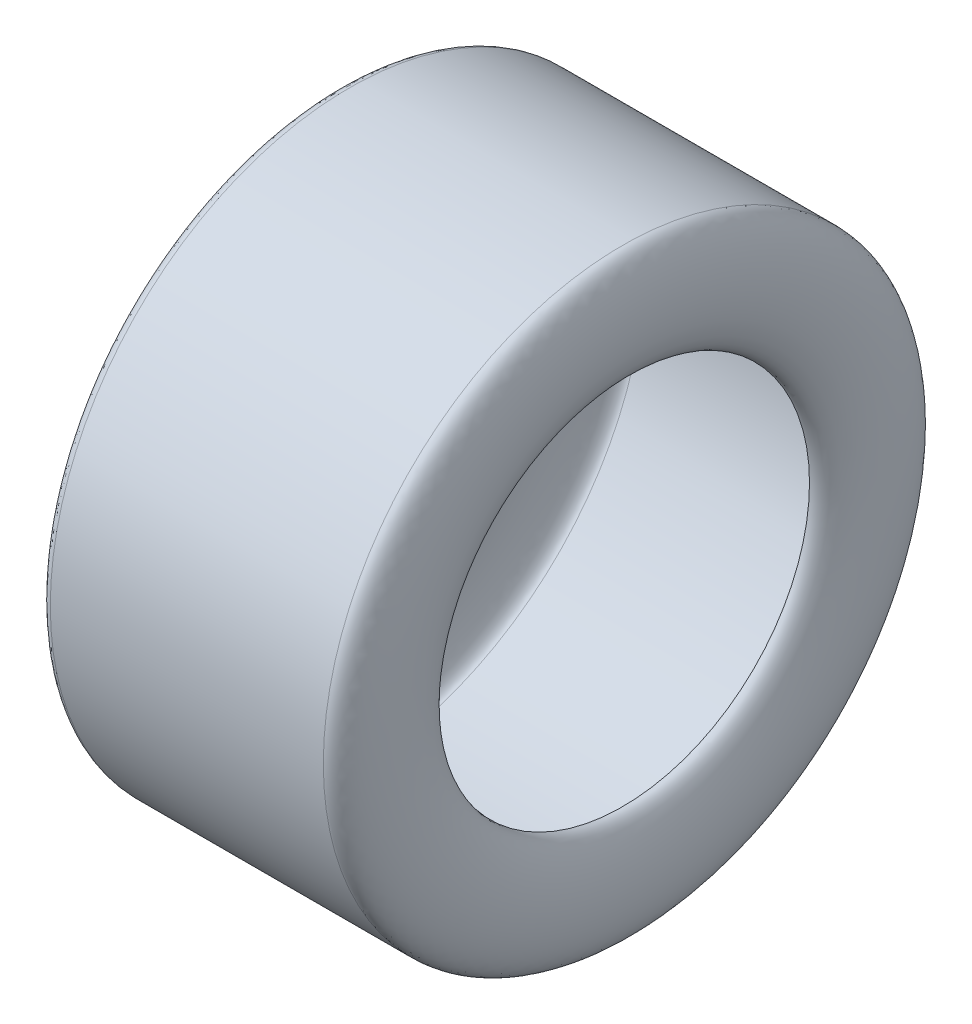
ISO-10303-21;
HEADER;
FILE_DESCRIPTION(('STEP AP214'),'2;1');
FILE_NAME('part.step','',(''),(''),'','','');
FILE_SCHEMA(('AUTOMOTIVE_DESIGN { 1 0 10303 214 1 1 1 1 }'));
ENDSEC;
DATA;
#1=APPLICATION_CONTEXT('core data for automotive mechanical design processes');
#2=APPLICATION_PROTOCOL_DEFINITION('international standard','automotive_design',2000,#1);
#3=PRODUCT_CONTEXT('',#1,'mechanical');
#4=PRODUCT('Part','Part','',(#3));
#5=PRODUCT_RELATED_PRODUCT_CATEGORY('part','',(#4));
#6=PRODUCT_DEFINITION_FORMATION('','',#4);
#7=PRODUCT_DEFINITION_CONTEXT('part definition',#1,'design');
#8=PRODUCT_DEFINITION('design','',#6,#7);
#9=PRODUCT_DEFINITION_SHAPE('','',#8);
#10=(LENGTH_UNIT() NAMED_UNIT(*) SI_UNIT(.MILLI.,.METRE.));
#11=(NAMED_UNIT(*) PLANE_ANGLE_UNIT() SI_UNIT($,.RADIAN.));
#12=(NAMED_UNIT(*) SI_UNIT($,.STERADIAN.) SOLID_ANGLE_UNIT());
#13=UNCERTAINTY_MEASURE_WITH_UNIT(LENGTH_MEASURE(1.E-05),#10,'distance_accuracy_value','');
#14=(GEOMETRIC_REPRESENTATION_CONTEXT(3) GLOBAL_UNCERTAINTY_ASSIGNED_CONTEXT((#13)) GLOBAL_UNIT_ASSIGNED_CONTEXT((#10,
#11,#12)) REPRESENTATION_CONTEXT('',''));
#15=CARTESIAN_POINT('',(0.,0.,0.));
#16=DIRECTION('',(0.,0.,1.));
#17=DIRECTION('',(1.,0.,0.));
#18=AXIS2_PLACEMENT_3D('',#15,#16,#17);
#19=CARTESIAN_POINT('',(92.71,0.,0.));
#20=DIRECTION('',(1.,0.,0.));
#21=DIRECTION('',(0.,0.,-1.));
#22=AXIS2_PLACEMENT_3D('',#19,#20,#21);
#23=PLANE('',#22);
#24=CARTESIAN_POINT('',(92.71,0.,0.));
#25=DIRECTION('',(1.,0.,0.));
#26=DIRECTION('',(0.,0.,-1.));
#27=AXIS2_PLACEMENT_3D('',#24,#25,#26);
#28=CIRCLE('',#27,127.);
#29=CARTESIAN_POINT('',(92.71,0.,-127.));
#30=VERTEX_POINT('',#29);
#31=EDGE_CURVE('E5083',#30,#30,#28,.T.);
#32=ORIENTED_EDGE('',*,*,#31,.T.);
#33=EDGE_LOOP('',(#32));
#34=FACE_BOUND('',#33,.T.);
#35=CARTESIAN_POINT('',(92.71,0.,0.));
#36=DIRECTION('',(1.,0.,0.));
#37=DIRECTION('',(0.,1.,0.));
#38=AXIS2_PLACEMENT_3D('',#35,#36,#37);
#39=CIRCLE('',#38,129.54);
#40=CARTESIAN_POINT('',(92.71,129.54,0.));
#41=VERTEX_POINT('',#40);
#42=EDGE_CURVE('E5086',#41,#41,#39,.T.);
#43=ORIENTED_EDGE('',*,*,#42,.F.);
#44=EDGE_LOOP('',(#43));
#45=FACE_BOUND('',#44,.T.);
#46=ADVANCED_FACE('F5029',(#34,#45),#23,.F.);
#47=CARTESIAN_POINT('',(-92.71,0.,0.));
#48=DIRECTION('',(1.,0.,0.));
#49=DIRECTION('',(0.,0.,-1.));
#50=AXIS2_PLACEMENT_3D('',#47,#48,#49);
#51=PLANE('',#50);
#52=CARTESIAN_POINT('',(-92.71,0.,0.));
#53=DIRECTION('',(1.,0.,0.));
#54=DIRECTION('',(0.,0.,-1.));
#55=AXIS2_PLACEMENT_3D('',#52,#53,#54);
#56=CIRCLE('',#55,127.);
#57=CARTESIAN_POINT('',(-92.71,0.,-127.));
#58=VERTEX_POINT('',#57);
#59=EDGE_CURVE('E12',#58,#58,#56,.T.);
#60=ORIENTED_EDGE('',*,*,#59,.F.);
#61=EDGE_LOOP('',(#60));
#62=FACE_BOUND('',#61,.T.);
#63=CARTESIAN_POINT('',(-92.71,0.,0.));
#64=DIRECTION('',(1.,0.,0.));
#65=DIRECTION('',(0.,1.,0.));
#66=AXIS2_PLACEMENT_3D('',#63,#64,#65);
#67=CIRCLE('',#66,129.54);
#68=CARTESIAN_POINT('',(-92.71,129.54,0.));
#69=VERTEX_POINT('',#68);
#70=EDGE_CURVE('E5091',#69,#69,#67,.T.);
#71=ORIENTED_EDGE('',*,*,#70,.T.);
#72=EDGE_LOOP('',(#71));
#73=FACE_BOUND('',#72,.T.);
#74=ADVANCED_FACE('F5031',(#62,#73),#51,.T.);
#75=CARTESIAN_POINT('',(-92.71,165.1,0.));
#76=DIRECTION('',(0.,0.,1.));
#77=DIRECTION('',(0.,1.,0.));
#78=AXIS2_PLACEMENT_3D('',#75,#76,#77);
#79=ELLIPSE('',#78,38.1,13.97);
#80=CARTESIAN_POINT('',(0.,0.,0.));
#81=DIRECTION('',(1.,0.,0.));
#82=AXIS1_PLACEMENT('',#80,#81);
#83=SURFACE_OF_REVOLUTION('',#79,#82);
#84=ORIENTED_EDGE('',*,*,#59,.T.);
#85=EDGE_LOOP('',(#84));
#86=FACE_BOUND('',#85,.T.);
#87=CARTESIAN_POINT('',(-92.71,0.,0.));
#88=DIRECTION('',(1.,0.,0.));
#89=DIRECTION('',(0.,0.,-1.));
#90=AXIS2_PLACEMENT_3D('',#87,#88,#89);
#91=CIRCLE('',#90,203.2);
#92=CARTESIAN_POINT('',(-92.71,0.,-203.2));
#93=VERTEX_POINT('',#92);
#94=EDGE_CURVE('E5037',#93,#93,#91,.T.);
#95=ORIENTED_EDGE('',*,*,#94,.F.);
#96=EDGE_LOOP('',(#95));
#97=FACE_BOUND('',#96,.T.);
#98=ADVANCED_FACE('F5068',(#86,#97),#83,.F.);
#99=CARTESIAN_POINT('',(0.,0.,0.));
#100=DIRECTION('',(1.,0.,0.));
#101=DIRECTION('',(0.,0.,-1.));
#102=AXIS2_PLACEMENT_3D('',#99,#100,#101);
#103=CYLINDRICAL_SURFACE('',#102,203.2);
#104=ORIENTED_EDGE('',*,*,#94,.T.);
#105=EDGE_LOOP('',(#104));
#106=FACE_BOUND('',#105,.T.);
#107=CARTESIAN_POINT('',(92.71,0.,0.));
#108=DIRECTION('',(1.,0.,0.));
#109=DIRECTION('',(0.,0.,-1.));
#110=AXIS2_PLACEMENT_3D('',#107,#108,#109);
#111=CIRCLE('',#110,203.2);
#112=CARTESIAN_POINT('',(92.71,0.,-203.2));
#113=VERTEX_POINT('',#112);
#114=EDGE_CURVE('E5042',#113,#113,#111,.T.);
#115=ORIENTED_EDGE('',*,*,#114,.F.);
#116=EDGE_LOOP('',(#115));
#117=FACE_BOUND('',#116,.T.);
#118=ADVANCED_FACE('F5058',(#106,#117),#103,.T.);
#119=CARTESIAN_POINT('',(92.71,165.1,0.));
#120=DIRECTION('',(0.,0.,1.));
#121=DIRECTION('',(0.,-1.,0.));
#122=AXIS2_PLACEMENT_3D('',#119,#120,#121);
#123=ELLIPSE('',#122,38.1,13.97);
#124=CARTESIAN_POINT('',(0.,0.,0.));
#125=DIRECTION('',(1.,0.,0.));
#126=AXIS1_PLACEMENT('',#124,#125);
#127=SURFACE_OF_REVOLUTION('',#123,#126);
#128=ORIENTED_EDGE('',*,*,#114,.T.);
#129=EDGE_LOOP('',(#128));
#130=FACE_BOUND('',#129,.T.);
#131=ORIENTED_EDGE('',*,*,#31,.F.);
#132=EDGE_LOOP('',(#131));
#133=FACE_BOUND('',#132,.T.);
#134=ADVANCED_FACE('F5052',(#130,#133),#127,.F.);
#135=CARTESIAN_POINT('',(0.,0.,0.));
#136=DIRECTION('',(1.,0.,0.));
#137=AXIS1_PLACEMENT('',#135,#136);
#138=SURFACE_OF_REVOLUTION('',#123,#137);
#139=OFFSET_SURFACE('',#138,2.54,.F.);
#140=CARTESIAN_POINT('',(92.71,0.,0.));
#141=DIRECTION('',(1.,0.,0.));
#142=DIRECTION('',(0.,1.,0.));
#143=AXIS2_PLACEMENT_3D('',#140,#141,#142);
#144=CIRCLE('',#143,200.66);
#145=CARTESIAN_POINT('',(92.71,200.66,0.));
#146=VERTEX_POINT('',#145);
#147=EDGE_CURVE('E5049',#146,#146,#144,.T.);
#148=ORIENTED_EDGE('',*,*,#147,.F.);
#149=EDGE_LOOP('',(#148));
#150=FACE_BOUND('',#149,.T.);
#151=ORIENTED_EDGE('',*,*,#42,.T.);
#152=EDGE_LOOP('',(#151));
#153=FACE_BOUND('',#152,.T.);
#154=ADVANCED_FACE('F5057',(#150,#153),#139,.T.);
#155=CARTESIAN_POINT('',(0.,0.,0.));
#156=DIRECTION('',(1.,0.,0.));
#157=AXIS1_PLACEMENT('',#155,#156);
#158=SURFACE_OF_REVOLUTION('',#79,#157);
#159=OFFSET_SURFACE('',#158,2.54,.F.);
#160=ORIENTED_EDGE('',*,*,#70,.F.);
#161=EDGE_LOOP('',(#160));
#162=FACE_BOUND('',#161,.T.);
#163=CARTESIAN_POINT('',(-92.71,0.,0.));
#164=DIRECTION('',(1.,0.,0.));
#165=DIRECTION('',(0.,0.,-1.));
#166=AXIS2_PLACEMENT_3D('',#163,#164,#165);
#167=CIRCLE('',#166,200.66);
#168=CARTESIAN_POINT('',(-92.71,0.,-200.66));
#169=VERTEX_POINT('',#168);
#170=EDGE_CURVE('E5090',#169,#169,#167,.T.);
#171=ORIENTED_EDGE('',*,*,#170,.T.);
#172=EDGE_LOOP('',(#171));
#173=FACE_BOUND('',#172,.T.);
#174=ADVANCED_FACE('F5062',(#162,#173),#159,.T.);
#175=CARTESIAN_POINT('',(0.,0.,0.));
#176=DIRECTION('',(1.,0.,0.));
#177=DIRECTION('',(0.,0.,-1.));
#178=AXIS2_PLACEMENT_3D('',#175,#176,#177);
#179=CYLINDRICAL_SURFACE('',#178,200.66);
#180=ORIENTED_EDGE('',*,*,#170,.F.);
#181=EDGE_LOOP('',(#180));
#182=FACE_BOUND('',#181,.T.);
#183=ORIENTED_EDGE('',*,*,#147,.T.);
#184=EDGE_LOOP('',(#183));
#185=FACE_BOUND('',#184,.T.);
#186=ADVANCED_FACE('F5066',(#182,#185),#179,.F.);
#187=CLOSED_SHELL('',(#46,#74,#98,#118,#134,#154,#174,#186));
#188=MANIFOLD_SOLID_BREP('B2',#187);
#189=ADVANCED_BREP_SHAPE_REPRESENTATION('',(#18,#188),#14);
#190=SHAPE_DEFINITION_REPRESENTATION(#9,#189);
ENDSEC;
END-ISO-10303-21;
